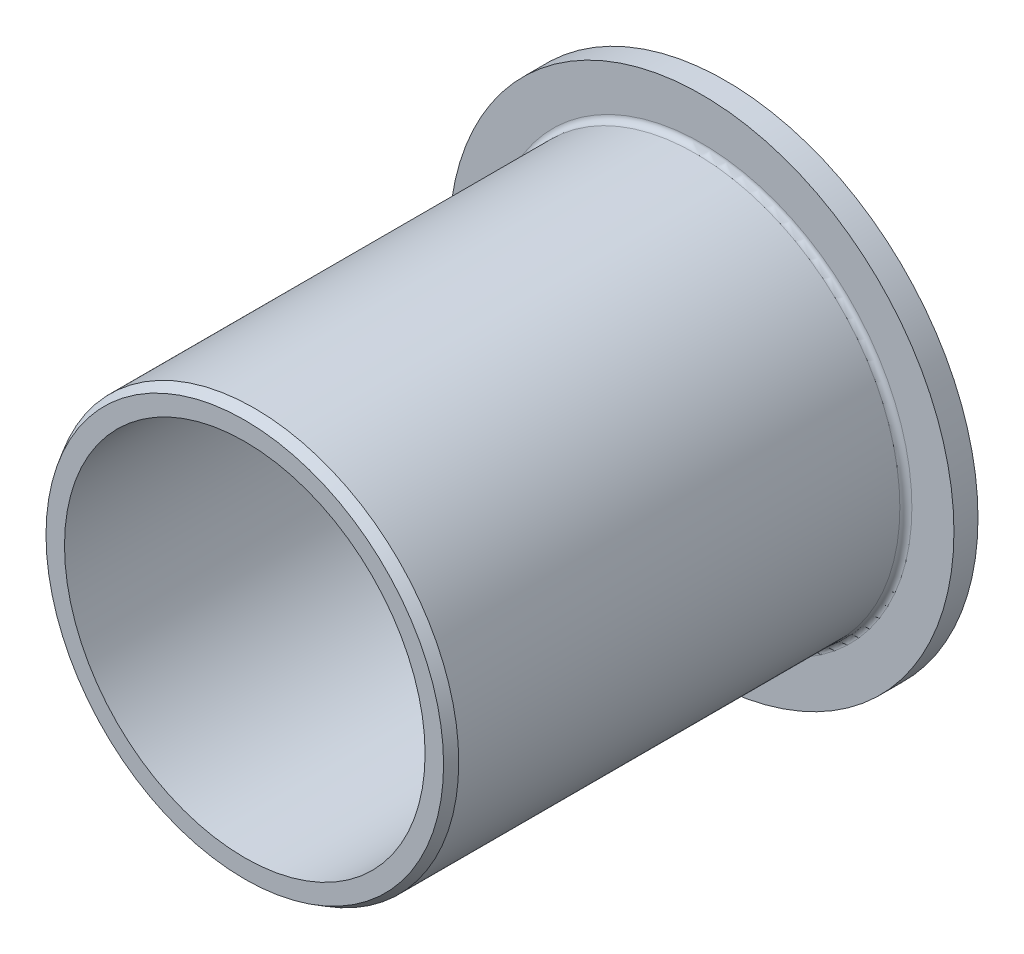
ISO-10303-21;
HEADER;
FILE_DESCRIPTION(('STEP AP214'),'2;1');
FILE_NAME('part.step','',(''),(''),'','','');
FILE_SCHEMA(('AUTOMOTIVE_DESIGN { 1 0 10303 214 1 1 1 1 }'));
ENDSEC;
DATA;
#1=APPLICATION_CONTEXT('core data for automotive mechanical design processes');
#2=APPLICATION_PROTOCOL_DEFINITION('international standard','automotive_design',2000,#1);
#3=PRODUCT_CONTEXT('',#1,'mechanical');
#4=PRODUCT('Part','Part','',(#3));
#5=PRODUCT_RELATED_PRODUCT_CATEGORY('part','',(#4));
#6=PRODUCT_DEFINITION_FORMATION('','',#4);
#7=PRODUCT_DEFINITION_CONTEXT('part definition',#1,'design');
#8=PRODUCT_DEFINITION('design','',#6,#7);
#9=PRODUCT_DEFINITION_SHAPE('','',#8);
#10=(LENGTH_UNIT() NAMED_UNIT(*) SI_UNIT(.MILLI.,.METRE.));
#11=(NAMED_UNIT(*) PLANE_ANGLE_UNIT() SI_UNIT($,.RADIAN.));
#12=(NAMED_UNIT(*) SI_UNIT($,.STERADIAN.) SOLID_ANGLE_UNIT());
#13=UNCERTAINTY_MEASURE_WITH_UNIT(LENGTH_MEASURE(1.E-05),#10,'distance_accuracy_value','');
#14=(GEOMETRIC_REPRESENTATION_CONTEXT(3) GLOBAL_UNCERTAINTY_ASSIGNED_CONTEXT((#13)) GLOBAL_UNIT_ASSIGNED_CONTEXT((#10,
#11,#12)) REPRESENTATION_CONTEXT('',''));
#15=CARTESIAN_POINT('',(0.,0.,0.));
#16=DIRECTION('',(0.,0.,1.));
#17=DIRECTION('',(1.,0.,0.));
#18=AXIS2_PLACEMENT_3D('',#15,#16,#17);
#19=CARTESIAN_POINT('',(18.,0.,0.));
#20=DIRECTION('',(0.,0.,-1.));
#21=DIRECTION('',(-1.,0.,0.));
#22=AXIS2_PLACEMENT_3D('',#19,#20,#21);
#23=PLANE('',#22);
#24=CARTESIAN_POINT('',(0.,0.,0.));
#25=DIRECTION('',(0.,0.,1.));
#26=DIRECTION('',(1.,0.,0.));
#27=AXIS2_PLACEMENT_3D('',#24,#25,#26);
#28=CIRCLE('',#27,15.);
#29=CARTESIAN_POINT('',(15.,0.,0.));
#30=VERTEX_POINT('',#29);
#31=EDGE_CURVE('E116',#30,#30,#28,.T.);
#32=ORIENTED_EDGE('',*,*,#31,.T.);
#33=EDGE_LOOP('',(#32));
#34=FACE_BOUND('',#33,.T.);
#35=CARTESIAN_POINT('',(0.,0.,0.));
#36=DIRECTION('',(0.,0.,1.));
#37=DIRECTION('',(1.,0.,0.));
#38=AXIS2_PLACEMENT_3D('',#35,#36,#37);
#39=CIRCLE('',#38,21.);
#40=CARTESIAN_POINT('',(21.,0.,0.));
#41=VERTEX_POINT('',#40);
#42=EDGE_CURVE('E119',#41,#41,#39,.T.);
#43=ORIENTED_EDGE('',*,*,#42,.F.);
#44=EDGE_LOOP('',(#43));
#45=FACE_BOUND('',#44,.T.);
#46=ADVANCED_FACE('F17',(#34,#45),#23,.T.);
#47=CARTESIAN_POINT('',(0.,0.,1.));
#48=DIRECTION('',(0.,0.,1.));
#49=DIRECTION('',(1.,0.,0.));
#50=AXIS2_PLACEMENT_3D('',#47,#48,#49);
#51=CYLINDRICAL_SURFACE('',#50,21.);
#52=CARTESIAN_POINT('',(0.,0.,2.));
#53=DIRECTION('',(0.,0.,1.));
#54=DIRECTION('',(1.,0.,0.));
#55=AXIS2_PLACEMENT_3D('',#52,#53,#54);
#56=CIRCLE('',#55,21.);
#57=CARTESIAN_POINT('',(21.,0.,2.));
#58=VERTEX_POINT('',#57);
#59=EDGE_CURVE('E42',#58,#58,#56,.T.);
#60=ORIENTED_EDGE('',*,*,#59,.F.);
#61=EDGE_LOOP('',(#60));
#62=FACE_BOUND('',#61,.T.);
#63=ORIENTED_EDGE('',*,*,#42,.T.);
#64=EDGE_LOOP('',(#63));
#65=FACE_BOUND('',#64,.T.);
#66=ADVANCED_FACE('F86',(#62,#65),#51,.T.);
#67=CARTESIAN_POINT('',(0.,0.,20.));
#68=DIRECTION('',(0.,0.,1.));
#69=DIRECTION('',(1.,0.,0.));
#70=AXIS2_PLACEMENT_3D('',#67,#68,#69);
#71=CYLINDRICAL_SURFACE('',#70,15.);
#72=ORIENTED_EDGE('',*,*,#31,.F.);
#73=EDGE_LOOP('',(#72));
#74=FACE_BOUND('',#73,.T.);
#75=CARTESIAN_POINT('',(0.,0.,40.));
#76=DIRECTION('',(0.,0.,1.));
#77=DIRECTION('',(1.,0.,0.));
#78=AXIS2_PLACEMENT_3D('',#75,#76,#77);
#79=CIRCLE('',#78,15.);
#80=CARTESIAN_POINT('',(15.,0.,40.));
#81=VERTEX_POINT('',#80);
#82=EDGE_CURVE('E41',#81,#81,#79,.F.);
#83=ORIENTED_EDGE('',*,*,#82,.F.);
#84=EDGE_LOOP('',(#83));
#85=FACE_BOUND('',#84,.T.);
#86=ADVANCED_FACE('F82',(#74,#85),#71,.F.);
#87=CARTESIAN_POINT('',(19.25,0.,2.));
#88=DIRECTION('',(0.,0.,1.));
#89=DIRECTION('',(1.,0.,0.));
#90=AXIS2_PLACEMENT_3D('',#87,#88,#89);
#91=PLANE('',#90);
#92=ORIENTED_EDGE('',*,*,#59,.T.);
#93=EDGE_LOOP('',(#92));
#94=FACE_BOUND('',#93,.T.);
#95=CARTESIAN_POINT('',(0.,0.,2.));
#96=DIRECTION('',(0.,0.,1.));
#97=DIRECTION('',(1.,0.,0.));
#98=AXIS2_PLACEMENT_3D('',#95,#96,#97);
#99=CIRCLE('',#98,17.5);
#100=CARTESIAN_POINT('',(-17.5,0.,2.));
#101=VERTEX_POINT('',#100);
#102=CARTESIAN_POINT('',(17.5,0.,2.));
#103=VERTEX_POINT('',#102);
#104=EDGE_CURVE('E34',#101,#103,#99,.F.);
#105=ORIENTED_EDGE('',*,*,#104,.T.);
#106=CARTESIAN_POINT('',(0.,0.,2.));
#107=DIRECTION('',(0.,0.,1.));
#108=DIRECTION('',(-1.,0.,0.));
#109=AXIS2_PLACEMENT_3D('',#106,#107,#108);
#110=CIRCLE('',#109,17.5);
#111=EDGE_CURVE('E37',#103,#101,#110,.F.);
#112=ORIENTED_EDGE('',*,*,#111,.T.);
#113=EDGE_LOOP('',(#105,#112));
#114=FACE_BOUND('',#113,.T.);
#115=ADVANCED_FACE('F39',(#94,#114),#91,.T.);
#116=CARTESIAN_POINT('',(15.7690598923,0.,40.));
#117=DIRECTION('',(0.,0.,1.));
#118=DIRECTION('',(1.,0.,0.));
#119=AXIS2_PLACEMENT_3D('',#116,#117,#118);
#120=PLANE('',#119);
#121=CARTESIAN_POINT('',(0.,0.,40.));
#122=DIRECTION('',(0.,0.,-1.));
#123=DIRECTION('',(0.,1.,0.));
#124=AXIS2_PLACEMENT_3D('',#121,#122,#123);
#125=CIRCLE('',#124,16.5381197846);
#126=CARTESIAN_POINT('',(0.,16.5381197846,40.));
#127=VERTEX_POINT('',#126);
#128=EDGE_CURVE('E47',#127,#127,#125,.T.);
#129=ORIENTED_EDGE('',*,*,#128,.F.);
#130=EDGE_LOOP('',(#129));
#131=FACE_BOUND('',#130,.T.);
#132=ORIENTED_EDGE('',*,*,#82,.T.);
#133=EDGE_LOOP('',(#132));
#134=FACE_BOUND('',#133,.T.);
#135=ADVANCED_FACE('F66',(#131,#134),#120,.T.);
#136=CARTESIAN_POINT('',(0.,0.,2.50000000000001));
#137=DIRECTION('',(0.,0.,1.));
#138=DIRECTION('',(1.,0.,0.));
#139=AXIS2_PLACEMENT_3D('',#136,#137,#138);
#140=TOROIDAL_SURFACE('',#139,17.5,0.500000000000007);
#141=CARTESIAN_POINT('',(0.,0.,2.5));
#142=DIRECTION('',(0.,0.,1.));
#143=DIRECTION('',(1.,0.,0.));
#144=AXIS2_PLACEMENT_3D('',#141,#142,#143);
#145=CIRCLE('',#144,17.);
#146=CARTESIAN_POINT('',(17.,0.,2.5));
#147=VERTEX_POINT('',#146);
#148=EDGE_CURVE('E27',#147,#147,#145,.T.);
#149=ORIENTED_EDGE('',*,*,#148,.F.);
#150=EDGE_LOOP('',(#149));
#151=FACE_BOUND('',#150,.T.);
#152=ORIENTED_EDGE('',*,*,#111,.F.);
#153=ORIENTED_EDGE('',*,*,#104,.F.);
#154=EDGE_LOOP('',(#152,#153));
#155=FACE_BOUND('',#154,.T.);
#156=ADVANCED_FACE('F46',(#151,#155),#140,.F.);
#157=CARTESIAN_POINT('',(0.,0.,39.2));
#158=DIRECTION('',(0.,0.,-1.));
#159=DIRECTION('',(0.,1.,0.));
#160=AXIS2_PLACEMENT_3D('',#157,#158,#159);
#161=CONICAL_SURFACE('',#160,17.,0.523598775643583);
#162=ORIENTED_EDGE('',*,*,#128,.T.);
#163=EDGE_LOOP('',(#162));
#164=FACE_BOUND('',#163,.T.);
#165=CARTESIAN_POINT('',(0.,0.,39.2));
#166=DIRECTION('',(0.,0.,1.));
#167=DIRECTION('',(1.,0.,0.));
#168=AXIS2_PLACEMENT_3D('',#165,#166,#167);
#169=CIRCLE('',#168,17.);
#170=CARTESIAN_POINT('',(17.,0.,39.2));
#171=VERTEX_POINT('',#170);
#172=EDGE_CURVE('E11',#171,#171,#169,.F.);
#173=ORIENTED_EDGE('',*,*,#172,.F.);
#174=EDGE_LOOP('',(#173));
#175=FACE_BOUND('',#174,.T.);
#176=ADVANCED_FACE('F65',(#164,#175),#161,.T.);
#177=CARTESIAN_POINT('',(0.,0.,20.85));
#178=DIRECTION('',(0.,0.,1.));
#179=DIRECTION('',(1.,0.,0.));
#180=AXIS2_PLACEMENT_3D('',#177,#178,#179);
#181=CYLINDRICAL_SURFACE('',#180,17.);
#182=ORIENTED_EDGE('',*,*,#148,.T.);
#183=EDGE_LOOP('',(#182));
#184=FACE_BOUND('',#183,.T.);
#185=ORIENTED_EDGE('',*,*,#172,.T.);
#186=EDGE_LOOP('',(#185));
#187=FACE_BOUND('',#186,.T.);
#188=ADVANCED_FACE('F97',(#184,#187),#181,.T.);
#189=CLOSED_SHELL('',(#46,#66,#86,#115,#135,#156,#176,#188));
#190=MANIFOLD_SOLID_BREP('B1',#189);
#191=ADVANCED_BREP_SHAPE_REPRESENTATION('',(#18,#190),#14);
#192=SHAPE_DEFINITION_REPRESENTATION(#9,#191);
ENDSEC;
END-ISO-10303-21;
